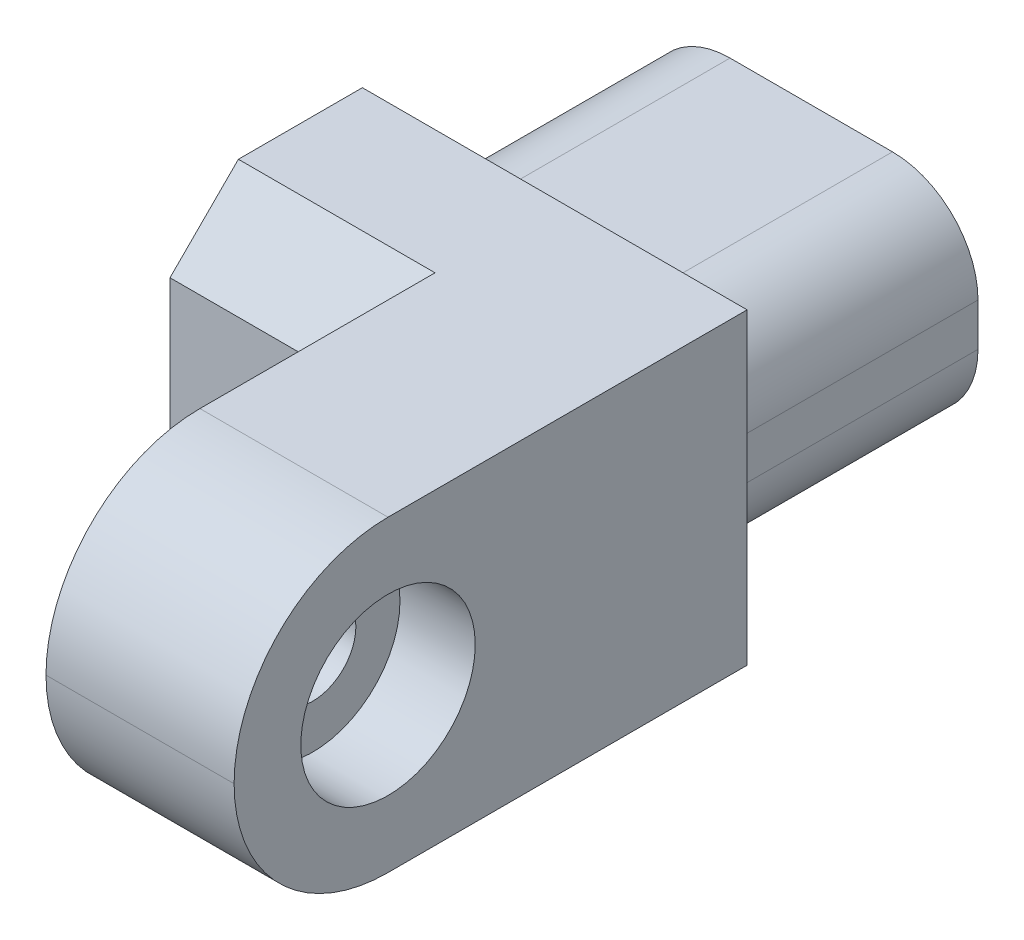
ISO-10303-21;
HEADER;
FILE_DESCRIPTION(('STEP AP214'),'2;1');
FILE_NAME('part.step','',(''),(''),'','','');
FILE_SCHEMA(('AUTOMOTIVE_DESIGN { 1 0 10303 214 1 1 1 1 }'));
ENDSEC;
DATA;
#1=APPLICATION_CONTEXT('core data for automotive mechanical design processes');
#2=APPLICATION_PROTOCOL_DEFINITION('international standard','automotive_design',2000,#1);
#3=PRODUCT_CONTEXT('',#1,'mechanical');
#4=PRODUCT('Part','Part','',(#3));
#5=PRODUCT_RELATED_PRODUCT_CATEGORY('part','',(#4));
#6=PRODUCT_DEFINITION_FORMATION('','',#4);
#7=PRODUCT_DEFINITION_CONTEXT('part definition',#1,'design');
#8=PRODUCT_DEFINITION('design','',#6,#7);
#9=PRODUCT_DEFINITION_SHAPE('','',#8);
#10=(LENGTH_UNIT() NAMED_UNIT(*) SI_UNIT(.MILLI.,.METRE.));
#11=(NAMED_UNIT(*) PLANE_ANGLE_UNIT() SI_UNIT($,.RADIAN.));
#12=(NAMED_UNIT(*) SI_UNIT($,.STERADIAN.) SOLID_ANGLE_UNIT());
#13=UNCERTAINTY_MEASURE_WITH_UNIT(LENGTH_MEASURE(1.E-05),#10,'distance_accuracy_value','');
#14=(GEOMETRIC_REPRESENTATION_CONTEXT(3) GLOBAL_UNCERTAINTY_ASSIGNED_CONTEXT((#13)) GLOBAL_UNIT_ASSIGNED_CONTEXT((#10,
#11,#12)) REPRESENTATION_CONTEXT('',''));
#15=CARTESIAN_POINT('',(0.,0.,0.));
#16=DIRECTION('',(0.,0.,1.));
#17=DIRECTION('',(1.,0.,0.));
#18=AXIS2_PLACEMENT_3D('',#15,#16,#17);
#19=CARTESIAN_POINT('',(14.2875,-11.43,38.1));
#20=DIRECTION('',(-1.,0.,0.));
#21=DIRECTION('',(0.,0.,1.));
#22=AXIS2_PLACEMENT_3D('',#19,#20,#21);
#23=PLANE('',#22);
#24=DIRECTION('',(0.,0.,-1.));
#25=VECTOR('',#24,1.);
#26=CARTESIAN_POINT('',(14.2875,11.43,38.1));
#27=LINE('',#26,#25);
#28=CARTESIAN_POINT('',(14.2875,11.43,26.67));
#29=VERTEX_POINT('',#28);
#30=CARTESIAN_POINT('',(14.2875,11.43,0.));
#31=VERTEX_POINT('',#30);
#32=EDGE_CURVE('E208',#29,#31,#27,.T.);
#33=ORIENTED_EDGE('',*,*,#32,.F.);
#34=CARTESIAN_POINT('',(14.2875,0.,26.67));
#35=DIRECTION('',(-1.,0.,0.));
#36=DIRECTION('',(0.,0.,1.));
#37=AXIS2_PLACEMENT_3D('',#34,#35,#36);
#38=CIRCLE('',#37,11.43);
#39=CARTESIAN_POINT('',(14.2875,0.,38.1));
#40=VERTEX_POINT('',#39);
#41=EDGE_CURVE('E257',#29,#40,#38,.F.);
#42=ORIENTED_EDGE('',*,*,#41,.T.);
#43=CARTESIAN_POINT('',(14.2875,0.,26.67));
#44=DIRECTION('',(-1.,0.,0.));
#45=DIRECTION('',(0.,0.,1.));
#46=AXIS2_PLACEMENT_3D('',#43,#44,#45);
#47=CIRCLE('',#46,11.43);
#48=CARTESIAN_POINT('',(14.2875,-11.43,26.67));
#49=VERTEX_POINT('',#48);
#50=EDGE_CURVE('E254',#40,#49,#47,.F.);
#51=ORIENTED_EDGE('',*,*,#50,.T.);
#52=DIRECTION('',(0.,0.,-1.));
#53=VECTOR('',#52,1.);
#54=CARTESIAN_POINT('',(14.2875,-11.43,38.1));
#55=LINE('',#54,#53);
#56=CARTESIAN_POINT('',(14.2875,-11.43,0.));
#57=VERTEX_POINT('',#56);
#58=EDGE_CURVE('E177',#49,#57,#55,.T.);
#59=ORIENTED_EDGE('',*,*,#58,.T.);
#60=DIRECTION('',(0.,1.,0.));
#61=VECTOR('',#60,1.);
#62=CARTESIAN_POINT('',(14.2875,-11.43,0.));
#63=LINE('',#62,#61);
#64=EDGE_CURVE('E186',#57,#31,#63,.T.);
#65=ORIENTED_EDGE('',*,*,#64,.T.);
#66=EDGE_LOOP('',(#33,#42,#51,#59,#65));
#67=FACE_BOUND('',#66,.T.);
#68=CARTESIAN_POINT('',(14.2875,0.,26.67));
#69=DIRECTION('',(1.,0.,0.));
#70=DIRECTION('',(0.,0.,-1.));
#71=AXIS2_PLACEMENT_3D('',#68,#69,#70);
#72=CIRCLE('',#71,6.477);
#73=CARTESIAN_POINT('',(14.2875,0.,20.193));
#74=VERTEX_POINT('',#73);
#75=EDGE_CURVE('E367',#74,#74,#72,.T.);
#76=ORIENTED_EDGE('',*,*,#75,.F.);
#77=EDGE_LOOP('',(#76));
#78=FACE_BOUND('',#77,.T.);
#79=ADVANCED_FACE('F43',(#67,#78),#23,.F.);
#80=CARTESIAN_POINT('',(-12.3825,-7.9375,-19.05));
#81=DIRECTION('',(-1.,0.,0.));
#82=DIRECTION('',(0.,0.,1.));
#83=AXIS2_PLACEMENT_3D('',#80,#81,#82);
#84=PLANE('',#83);
#85=DIRECTION('',(0.,-1.,0.));
#86=VECTOR('',#85,1.);
#87=CARTESIAN_POINT('',(-12.3825,-7.9375,-19.05));
#88=LINE('',#87,#86);
#89=CARTESIAN_POINT('',(-12.3825,1.5875,-19.05));
#90=VERTEX_POINT('',#89);
#91=CARTESIAN_POINT('',(-12.3825,-1.5875,-19.05));
#92=VERTEX_POINT('',#91);
#93=EDGE_CURVE('E213',#90,#92,#88,.T.);
#94=ORIENTED_EDGE('',*,*,#93,.T.);
#95=DIRECTION('',(0.,0.,1.));
#96=VECTOR('',#95,1.);
#97=CARTESIAN_POINT('',(-12.3825,-1.5875,-19.05));
#98=LINE('',#97,#96);
#99=CARTESIAN_POINT('',(-12.3825,-1.5875,0.));
#100=VERTEX_POINT('',#99);
#101=EDGE_CURVE('E272',#92,#100,#98,.T.);
#102=ORIENTED_EDGE('',*,*,#101,.T.);
#103=DIRECTION('',(0.,-1.,0.));
#104=VECTOR('',#103,1.);
#105=CARTESIAN_POINT('',(-12.3825,-7.9375,0.));
#106=LINE('',#105,#104);
#107=CARTESIAN_POINT('',(-12.3825,1.5875,0.));
#108=VERTEX_POINT('',#107);
#109=EDGE_CURVE('E176',#108,#100,#106,.T.);
#110=ORIENTED_EDGE('',*,*,#109,.F.);
#111=DIRECTION('',(0.,0.,1.));
#112=VECTOR('',#111,1.);
#113=CARTESIAN_POINT('',(-12.3825,1.5875,-19.05));
#114=LINE('',#113,#112);
#115=EDGE_CURVE('E263',#108,#90,#114,.F.);
#116=ORIENTED_EDGE('',*,*,#115,.T.);
#117=EDGE_LOOP('',(#94,#102,#110,#116));
#118=FACE_BOUND('',#117,.T.);
#119=ADVANCED_FACE('F403',(#118),#84,.T.);
#120=CARTESIAN_POINT('',(12.3825,7.9375,-19.05));
#121=DIRECTION('',(0.,1.,0.));
#122=DIRECTION('',(-1.,0.,0.));
#123=AXIS2_PLACEMENT_3D('',#120,#121,#122);
#124=PLANE('',#123);
#125=DIRECTION('',(-1.,0.,0.));
#126=VECTOR('',#125,1.);
#127=CARTESIAN_POINT('',(12.3825,7.9375,-19.05));
#128=LINE('',#127,#126);
#129=CARTESIAN_POINT('',(6.03250000000001,7.9375,-19.05));
#130=VERTEX_POINT('',#129);
#131=CARTESIAN_POINT('',(-6.03249999999999,7.9375,-19.05));
#132=VERTEX_POINT('',#131);
#133=EDGE_CURVE('E226',#130,#132,#128,.T.);
#134=ORIENTED_EDGE('',*,*,#133,.T.);
#135=DIRECTION('',(0.,0.,1.));
#136=VECTOR('',#135,1.);
#137=CARTESIAN_POINT('',(-6.03249999999999,7.9375,-19.05));
#138=LINE('',#137,#136);
#139=CARTESIAN_POINT('',(-6.03249999999999,7.9375,0.));
#140=VERTEX_POINT('',#139);
#141=EDGE_CURVE('E298',#132,#140,#138,.T.);
#142=ORIENTED_EDGE('',*,*,#141,.T.);
#143=DIRECTION('',(-1.,0.,0.));
#144=VECTOR('',#143,1.);
#145=CARTESIAN_POINT('',(12.3825,7.9375,0.));
#146=LINE('',#145,#144);
#147=CARTESIAN_POINT('',(6.03250000000001,7.9375,0.));
#148=VERTEX_POINT('',#147);
#149=EDGE_CURVE('E218',#148,#140,#146,.T.);
#150=ORIENTED_EDGE('',*,*,#149,.F.);
#151=DIRECTION('',(0.,0.,1.));
#152=VECTOR('',#151,1.);
#153=CARTESIAN_POINT('',(6.03250000000001,7.9375,-19.05));
#154=LINE('',#153,#152);
#155=EDGE_CURVE('E295',#148,#130,#154,.F.);
#156=ORIENTED_EDGE('',*,*,#155,.T.);
#157=EDGE_LOOP('',(#134,#142,#150,#156));
#158=FACE_BOUND('',#157,.T.);
#159=ADVANCED_FACE('F409',(#158),#124,.T.);
#160=CARTESIAN_POINT('',(12.3825,-7.9375,-19.05));
#161=DIRECTION('',(1.,0.,0.));
#162=DIRECTION('',(0.,0.,-1.));
#163=AXIS2_PLACEMENT_3D('',#160,#161,#162);
#164=PLANE('',#163);
#165=DIRECTION('',(0.,1.,0.));
#166=VECTOR('',#165,1.);
#167=CARTESIAN_POINT('',(12.3825,-7.9375,0.));
#168=LINE('',#167,#166);
#169=CARTESIAN_POINT('',(12.3825,-1.5875,0.));
#170=VERTEX_POINT('',#169);
#171=CARTESIAN_POINT('',(12.3825,1.5875,0.));
#172=VERTEX_POINT('',#171);
#173=EDGE_CURVE('E238',#170,#172,#168,.T.);
#174=ORIENTED_EDGE('',*,*,#173,.F.);
#175=DIRECTION('',(0.,0.,1.));
#176=VECTOR('',#175,1.);
#177=CARTESIAN_POINT('',(12.3825,-1.5875,-19.05));
#178=LINE('',#177,#176);
#179=CARTESIAN_POINT('',(12.3825,-1.5875,-19.05));
#180=VERTEX_POINT('',#179);
#181=EDGE_CURVE('E306',#170,#180,#178,.F.);
#182=ORIENTED_EDGE('',*,*,#181,.T.);
#183=DIRECTION('',(0.,1.,0.));
#184=VECTOR('',#183,1.);
#185=CARTESIAN_POINT('',(12.3825,-7.9375,-19.05));
#186=LINE('',#185,#184);
#187=CARTESIAN_POINT('',(12.3825,1.5875,-19.05));
#188=VERTEX_POINT('',#187);
#189=EDGE_CURVE('E222',#180,#188,#186,.T.);
#190=ORIENTED_EDGE('',*,*,#189,.T.);
#191=DIRECTION('',(0.,0.,1.));
#192=VECTOR('',#191,1.);
#193=CARTESIAN_POINT('',(12.3825,1.5875,-19.05));
#194=LINE('',#193,#192);
#195=EDGE_CURVE('E302',#188,#172,#194,.T.);
#196=ORIENTED_EDGE('',*,*,#195,.T.);
#197=EDGE_LOOP('',(#174,#182,#190,#196));
#198=FACE_BOUND('',#197,.T.);
#199=ADVANCED_FACE('F427',(#198),#164,.T.);
#200=CARTESIAN_POINT('',(12.3825,-7.9375,-19.05));
#201=DIRECTION('',(0.,-1.,0.));
#202=DIRECTION('',(1.,0.,0.));
#203=AXIS2_PLACEMENT_3D('',#200,#201,#202);
#204=PLANE('',#203);
#205=DIRECTION('',(1.,0.,0.));
#206=VECTOR('',#205,1.);
#207=CARTESIAN_POINT('',(12.3825,-7.9375,0.));
#208=LINE('',#207,#206);
#209=CARTESIAN_POINT('',(-6.0325,-7.9375,0.));
#210=VERTEX_POINT('',#209);
#211=CARTESIAN_POINT('',(6.03250000000001,-7.9375,0.));
#212=VERTEX_POINT('',#211);
#213=EDGE_CURVE('E234',#210,#212,#208,.T.);
#214=ORIENTED_EDGE('',*,*,#213,.F.);
#215=DIRECTION('',(0.,0.,1.));
#216=VECTOR('',#215,1.);
#217=CARTESIAN_POINT('',(-6.0325,-7.9375,-19.05));
#218=LINE('',#217,#216);
#219=CARTESIAN_POINT('',(-6.0325,-7.9375,-19.05));
#220=VERTEX_POINT('',#219);
#221=EDGE_CURVE('E280',#210,#220,#218,.F.);
#222=ORIENTED_EDGE('',*,*,#221,.T.);
#223=DIRECTION('',(1.,0.,0.));
#224=VECTOR('',#223,1.);
#225=CARTESIAN_POINT('',(12.3825,-7.9375,-19.05));
#226=LINE('',#225,#224);
#227=CARTESIAN_POINT('',(6.03250000000001,-7.9375,-19.05));
#228=VERTEX_POINT('',#227);
#229=EDGE_CURVE('E217',#220,#228,#226,.T.);
#230=ORIENTED_EDGE('',*,*,#229,.T.);
#231=DIRECTION('',(0.,0.,1.));
#232=VECTOR('',#231,1.);
#233=CARTESIAN_POINT('',(6.03250000000001,-7.9375,-19.05));
#234=LINE('',#233,#232);
#235=EDGE_CURVE('E276',#228,#212,#234,.T.);
#236=ORIENTED_EDGE('',*,*,#235,.T.);
#237=EDGE_LOOP('',(#214,#222,#230,#236));
#238=FACE_BOUND('',#237,.T.);
#239=ADVANCED_FACE('F423',(#238),#204,.T.);
#240=CARTESIAN_POINT('',(0.,0.,-19.05));
#241=DIRECTION('',(0.,0.,1.));
#242=DIRECTION('',(1.,0.,0.));
#243=AXIS2_PLACEMENT_3D('',#240,#241,#242);
#244=PLANE('',#243);
#245=ORIENTED_EDGE('',*,*,#229,.F.);
#246=CARTESIAN_POINT('',(-6.0325,-1.5875,-19.05));
#247=DIRECTION('',(0.,0.,1.));
#248=DIRECTION('',(1.,0.,0.));
#249=AXIS2_PLACEMENT_3D('',#246,#247,#248);
#250=CIRCLE('',#249,6.35);
#251=EDGE_CURVE('E292',#220,#92,#250,.F.);
#252=ORIENTED_EDGE('',*,*,#251,.T.);
#253=ORIENTED_EDGE('',*,*,#93,.F.);
#254=CARTESIAN_POINT('',(-6.03249999999999,1.5875,-19.05));
#255=DIRECTION('',(0.,0.,1.));
#256=DIRECTION('',(1.,0.,0.));
#257=AXIS2_PLACEMENT_3D('',#254,#255,#256);
#258=CIRCLE('',#257,6.35);
#259=EDGE_CURVE('E289',#90,#132,#258,.F.);
#260=ORIENTED_EDGE('',*,*,#259,.T.);
#261=ORIENTED_EDGE('',*,*,#133,.F.);
#262=CARTESIAN_POINT('',(6.03250000000001,1.5875,-19.05));
#263=DIRECTION('',(0.,0.,1.));
#264=DIRECTION('',(1.,0.,0.));
#265=AXIS2_PLACEMENT_3D('',#262,#263,#264);
#266=CIRCLE('',#265,6.35);
#267=EDGE_CURVE('E283',#130,#188,#266,.F.);
#268=ORIENTED_EDGE('',*,*,#267,.T.);
#269=ORIENTED_EDGE('',*,*,#189,.F.);
#270=CARTESIAN_POINT('',(6.03250000000001,-1.5875,-19.05));
#271=DIRECTION('',(0.,0.,1.));
#272=DIRECTION('',(1.,0.,0.));
#273=AXIS2_PLACEMENT_3D('',#270,#271,#272);
#274=CIRCLE('',#273,6.35);
#275=EDGE_CURVE('E286',#180,#228,#274,.F.);
#276=ORIENTED_EDGE('',*,*,#275,.T.);
#277=EDGE_LOOP('',(#245,#252,#253,#260,#261,#268,#269,#276));
#278=FACE_BOUND('',#277,.T.);
#279=ADVANCED_FACE('F420',(#278),#244,.F.);
#280=CARTESIAN_POINT('',(0.,0.,0.));
#281=DIRECTION('',(0.,0.,1.));
#282=DIRECTION('',(1.,0.,0.));
#283=AXIS2_PLACEMENT_3D('',#280,#281,#282);
#284=PLANE('',#283);
#285=DIRECTION('',(0.,-1.,0.));
#286=VECTOR('',#285,1.);
#287=CARTESIAN_POINT('',(-14.2875,-11.43,0.));
#288=LINE('',#287,#286);
#289=CARTESIAN_POINT('',(-14.2875,11.43,0.));
#290=VERTEX_POINT('',#289);
#291=CARTESIAN_POINT('',(-14.2875,-11.43,0.));
#292=VERTEX_POINT('',#291);
#293=EDGE_CURVE('E184',#290,#292,#288,.T.);
#294=ORIENTED_EDGE('',*,*,#293,.F.);
#295=DIRECTION('',(-1.,0.,0.));
#296=VECTOR('',#295,1.);
#297=CARTESIAN_POINT('',(14.2875,11.43,0.));
#298=LINE('',#297,#296);
#299=EDGE_CURVE('E203',#31,#290,#298,.T.);
#300=ORIENTED_EDGE('',*,*,#299,.F.);
#301=ORIENTED_EDGE('',*,*,#64,.F.);
#302=DIRECTION('',(1.,0.,0.));
#303=VECTOR('',#302,1.);
#304=CARTESIAN_POINT('',(14.2875,-11.43,0.));
#305=LINE('',#304,#303);
#306=EDGE_CURVE('E169',#292,#57,#305,.T.);
#307=ORIENTED_EDGE('',*,*,#306,.F.);
#308=EDGE_LOOP('',(#294,#300,#301,#307));
#309=FACE_BOUND('',#308,.T.);
#310=ORIENTED_EDGE('',*,*,#173,.T.);
#311=CARTESIAN_POINT('',(6.03250000000001,1.5875,0.));
#312=DIRECTION('',(0.,0.,1.));
#313=DIRECTION('',(1.,0.,0.));
#314=AXIS2_PLACEMENT_3D('',#311,#312,#313);
#315=CIRCLE('',#314,6.35);
#316=EDGE_CURVE('E318',#172,#148,#315,.T.);
#317=ORIENTED_EDGE('',*,*,#316,.T.);
#318=ORIENTED_EDGE('',*,*,#149,.T.);
#319=CARTESIAN_POINT('',(-6.03249999999999,1.5875,0.));
#320=DIRECTION('',(0.,0.,1.));
#321=DIRECTION('',(1.,0.,0.));
#322=AXIS2_PLACEMENT_3D('',#319,#320,#321);
#323=CIRCLE('',#322,6.35);
#324=EDGE_CURVE('E312',#140,#108,#323,.T.);
#325=ORIENTED_EDGE('',*,*,#324,.T.);
#326=ORIENTED_EDGE('',*,*,#109,.T.);
#327=CARTESIAN_POINT('',(-6.0325,-1.5875,0.));
#328=DIRECTION('',(0.,0.,1.));
#329=DIRECTION('',(1.,0.,0.));
#330=AXIS2_PLACEMENT_3D('',#327,#328,#329);
#331=CIRCLE('',#330,6.35);
#332=EDGE_CURVE('E309',#100,#210,#331,.T.);
#333=ORIENTED_EDGE('',*,*,#332,.T.);
#334=ORIENTED_EDGE('',*,*,#213,.T.);
#335=CARTESIAN_POINT('',(6.03250000000001,-1.5875,0.));
#336=DIRECTION('',(0.,0.,1.));
#337=DIRECTION('',(1.,0.,0.));
#338=AXIS2_PLACEMENT_3D('',#335,#336,#337);
#339=CIRCLE('',#338,6.35);
#340=EDGE_CURVE('E315',#212,#170,#339,.T.);
#341=ORIENTED_EDGE('',*,*,#340,.T.);
#342=EDGE_LOOP('',(#310,#317,#318,#325,#326,#333,#334,#341));
#343=FACE_BOUND('',#342,.T.);
#344=ADVANCED_FACE('F181',(#309,#343),#284,.F.);
#345=CARTESIAN_POINT('',(-14.2875,-11.43,38.1));
#346=DIRECTION('',(1.,0.,0.));
#347=DIRECTION('',(0.,0.,-1.));
#348=AXIS2_PLACEMENT_3D('',#345,#346,#347);
#349=PLANE('',#348);
#350=DIRECTION('',(0.,0.,-1.));
#351=VECTOR('',#350,1.);
#352=CARTESIAN_POINT('',(-14.2875,-11.43,38.1));
#353=LINE('',#352,#351);
#354=CARTESIAN_POINT('',(-14.2875,-11.43,9.20749999999999));
#355=VERTEX_POINT('',#354);
#356=EDGE_CURVE('E165',#355,#292,#353,.T.);
#357=ORIENTED_EDGE('',*,*,#356,.F.);
#358=DIRECTION('',(0.,-0.707106781186546,-0.707106781186549));
#359=VECTOR('',#358,1.);
#360=CARTESIAN_POINT('',(-14.2875,-6.34999999999999,14.2875));
#361=LINE('',#360,#359);
#362=CARTESIAN_POINT('',(-14.2875,-6.34999999999999,14.2875));
#363=VERTEX_POINT('',#362);
#364=EDGE_CURVE('E332',#355,#363,#361,.F.);
#365=ORIENTED_EDGE('',*,*,#364,.T.);
#366=DIRECTION('',(0.,-1.,0.));
#367=VECTOR('',#366,1.);
#368=CARTESIAN_POINT('',(-14.2875,11.43,14.2875));
#369=LINE('',#368,#367);
#370=CARTESIAN_POINT('',(-14.2875,6.34999999999998,14.2875));
#371=VERTEX_POINT('',#370);
#372=EDGE_CURVE('E197',#371,#363,#369,.T.);
#373=ORIENTED_EDGE('',*,*,#372,.F.);
#374=DIRECTION('',(0.,-0.707106781186549,0.707106781186546));
#375=VECTOR('',#374,1.);
#376=CARTESIAN_POINT('',(-14.2875,11.43,9.20750000000001));
#377=LINE('',#376,#375);
#378=CARTESIAN_POINT('',(-14.2875,11.43,9.20750000000001));
#379=VERTEX_POINT('',#378);
#380=EDGE_CURVE('E68',#371,#379,#377,.F.);
#381=ORIENTED_EDGE('',*,*,#380,.T.);
#382=DIRECTION('',(0.,0.,-1.));
#383=VECTOR('',#382,1.);
#384=CARTESIAN_POINT('',(-14.2875,11.43,38.1));
#385=LINE('',#384,#383);
#386=EDGE_CURVE('E190',#379,#290,#385,.T.);
#387=ORIENTED_EDGE('',*,*,#386,.T.);
#388=ORIENTED_EDGE('',*,*,#293,.T.);
#389=EDGE_LOOP('',(#357,#365,#373,#381,#387,#388));
#390=FACE_BOUND('',#389,.T.);
#391=ADVANCED_FACE('F189',(#390),#349,.F.);
#392=CARTESIAN_POINT('',(14.2875,-11.43,38.1));
#393=DIRECTION('',(0.,1.,0.));
#394=DIRECTION('',(-1.,0.,0.));
#395=AXIS2_PLACEMENT_3D('',#392,#393,#394);
#396=PLANE('',#395);
#397=DIRECTION('',(0.,0.,1.));
#398=VECTOR('',#397,1.);
#399=CARTESIAN_POINT('',(0.317499999999998,-11.43,38.1));
#400=LINE('',#399,#398);
#401=CARTESIAN_POINT('',(0.317499999999998,-11.43,9.20749999999998));
#402=VERTEX_POINT('',#401);
#403=CARTESIAN_POINT('',(0.317499999999998,-11.43,26.67));
#404=VERTEX_POINT('',#403);
#405=EDGE_CURVE('E268',#402,#404,#400,.T.);
#406=ORIENTED_EDGE('',*,*,#405,.F.);
#407=DIRECTION('',(-1.,0.,0.));
#408=VECTOR('',#407,1.);
#409=CARTESIAN_POINT('',(14.2875,-11.43,9.20749999999998));
#410=LINE('',#409,#408);
#411=EDGE_CURVE('E172',#402,#355,#410,.T.);
#412=ORIENTED_EDGE('',*,*,#411,.T.);
#413=ORIENTED_EDGE('',*,*,#356,.T.);
#414=ORIENTED_EDGE('',*,*,#306,.T.);
#415=ORIENTED_EDGE('',*,*,#58,.F.);
#416=DIRECTION('',(1.,0.,0.));
#417=VECTOR('',#416,1.);
#418=CARTESIAN_POINT('',(0.317499999999998,-11.43,26.67));
#419=LINE('',#418,#417);
#420=EDGE_CURVE('E260',#49,#404,#419,.F.);
#421=ORIENTED_EDGE('',*,*,#420,.T.);
#422=EDGE_LOOP('',(#406,#412,#413,#414,#415,#421));
#423=FACE_BOUND('',#422,.T.);
#424=ADVANCED_FACE('F167',(#423),#396,.F.);
#425=CARTESIAN_POINT('',(14.2875,11.43,38.1));
#426=DIRECTION('',(0.,-1.,0.));
#427=DIRECTION('',(1.,0.,0.));
#428=AXIS2_PLACEMENT_3D('',#425,#426,#427);
#429=PLANE('',#428);
#430=ORIENTED_EDGE('',*,*,#386,.F.);
#431=DIRECTION('',(1.,0.,0.));
#432=VECTOR('',#431,1.);
#433=CARTESIAN_POINT('',(14.2875,11.43,9.20750000000001));
#434=LINE('',#433,#432);
#435=CARTESIAN_POINT('',(0.317499999999994,11.43,9.20750000000001));
#436=VERTEX_POINT('',#435);
#437=EDGE_CURVE('E335',#379,#436,#434,.T.);
#438=ORIENTED_EDGE('',*,*,#437,.T.);
#439=DIRECTION('',(0.,0.,1.));
#440=VECTOR('',#439,1.);
#441=CARTESIAN_POINT('',(0.317499999999994,11.43,38.1));
#442=LINE('',#441,#440);
#443=CARTESIAN_POINT('',(0.317499999999994,11.43,26.67));
#444=VERTEX_POINT('',#443);
#445=EDGE_CURVE('E60',#436,#444,#442,.T.);
#446=ORIENTED_EDGE('',*,*,#445,.T.);
#447=DIRECTION('',(-1.,0.,0.));
#448=VECTOR('',#447,1.);
#449=CARTESIAN_POINT('',(14.2875,11.43,26.67));
#450=LINE('',#449,#448);
#451=EDGE_CURVE('E250',#444,#29,#450,.F.);
#452=ORIENTED_EDGE('',*,*,#451,.T.);
#453=ORIENTED_EDGE('',*,*,#32,.T.);
#454=ORIENTED_EDGE('',*,*,#299,.T.);
#455=EDGE_LOOP('',(#430,#438,#446,#452,#453,#454));
#456=FACE_BOUND('',#455,.T.);
#457=ADVANCED_FACE('F392',(#456),#429,.F.);
#458=CARTESIAN_POINT('',(0.317499999999994,11.43,38.1));
#459=DIRECTION('',(1.,0.,0.));
#460=DIRECTION('',(0.,1.,0.));
#461=AXIS2_PLACEMENT_3D('',#458,#459,#460);
#462=PLANE('',#461);
#463=CARTESIAN_POINT('',(0.317499999999996,0.,26.67));
#464=DIRECTION('',(1.,0.,0.));
#465=DIRECTION('',(0.,1.,0.));
#466=AXIS2_PLACEMENT_3D('',#463,#464,#465);
#467=CIRCLE('',#466,6.477);
#468=CARTESIAN_POINT('',(0.317499999999995,6.477,26.67));
#469=VERTEX_POINT('',#468);
#470=EDGE_CURVE('E48',#469,#469,#467,.T.);
#471=ORIENTED_EDGE('',*,*,#470,.T.);
#472=EDGE_LOOP('',(#471));
#473=FACE_BOUND('',#472,.T.);
#474=CARTESIAN_POINT('',(0.317499999999996,0.,26.67));
#475=DIRECTION('',(1.,0.,0.));
#476=DIRECTION('',(0.,1.,0.));
#477=AXIS2_PLACEMENT_3D('',#474,#475,#476);
#478=CIRCLE('',#477,11.43);
#479=CARTESIAN_POINT('',(0.317499999999996,0.,38.1));
#480=VERTEX_POINT('',#479);
#481=EDGE_CURVE('E230',#404,#480,#478,.F.);
#482=ORIENTED_EDGE('',*,*,#481,.T.);
#483=CARTESIAN_POINT('',(0.317499999999996,0.,26.67));
#484=DIRECTION('',(1.,0.,0.));
#485=DIRECTION('',(0.,1.,0.));
#486=AXIS2_PLACEMENT_3D('',#483,#484,#485);
#487=CIRCLE('',#486,11.43);
#488=EDGE_CURVE('E247',#480,#444,#487,.F.);
#489=ORIENTED_EDGE('',*,*,#488,.T.);
#490=ORIENTED_EDGE('',*,*,#445,.F.);
#491=DIRECTION('',(0.,0.707106781186549,-0.707106781186546));
#492=VECTOR('',#491,1.);
#493=CARTESIAN_POINT('',(0.317499999999996,-3.01624999999999,23.65375));
#494=LINE('',#493,#492);
#495=CARTESIAN_POINT('',(0.317499999999995,6.34999999999999,14.2875));
#496=VERTEX_POINT('',#495);
#497=EDGE_CURVE('E11',#436,#496,#494,.F.);
#498=ORIENTED_EDGE('',*,*,#497,.T.);
#499=DIRECTION('',(0.,-1.,0.));
#500=VECTOR('',#499,1.);
#501=CARTESIAN_POINT('',(0.317499999999994,11.43,14.2875));
#502=LINE('',#501,#500);
#503=CARTESIAN_POINT('',(0.317499999999997,-6.34999999999999,14.2875));
#504=VERTEX_POINT('',#503);
#505=EDGE_CURVE('E193',#496,#504,#502,.T.);
#506=ORIENTED_EDGE('',*,*,#505,.T.);
#507=DIRECTION('',(0.,0.707106781186546,0.707106781186549));
#508=VECTOR('',#507,1.);
#509=CARTESIAN_POINT('',(0.317499999999993,14.44625,35.08375));
#510=LINE('',#509,#508);
#511=EDGE_CURVE('E54',#504,#402,#510,.F.);
#512=ORIENTED_EDGE('',*,*,#511,.T.);
#513=ORIENTED_EDGE('',*,*,#405,.T.);
#514=EDGE_LOOP('',(#482,#489,#490,#498,#506,#512,#513));
#515=FACE_BOUND('',#514,.T.);
#516=ADVANCED_FACE('F342',(#473,#515),#462,.F.);
#517=CARTESIAN_POINT('',(-14.2875,11.43,14.2875));
#518=DIRECTION('',(0.,0.,-1.));
#519=DIRECTION('',(-1.,0.,0.));
#520=AXIS2_PLACEMENT_3D('',#517,#518,#519);
#521=PLANE('',#520);
#522=ORIENTED_EDGE('',*,*,#372,.T.);
#523=DIRECTION('',(1.,0.,0.));
#524=VECTOR('',#523,1.);
#525=CARTESIAN_POINT('',(-14.2875,-6.34999999999999,14.2875));
#526=LINE('',#525,#524);
#527=EDGE_CURVE('E324',#363,#504,#526,.T.);
#528=ORIENTED_EDGE('',*,*,#527,.T.);
#529=ORIENTED_EDGE('',*,*,#505,.F.);
#530=DIRECTION('',(-1.,0.,0.));
#531=VECTOR('',#530,1.);
#532=CARTESIAN_POINT('',(-14.2875,6.34999999999998,14.2875));
#533=LINE('',#532,#531);
#534=EDGE_CURVE('E321',#496,#371,#533,.T.);
#535=ORIENTED_EDGE('',*,*,#534,.T.);
#536=EDGE_LOOP('',(#522,#528,#529,#535));
#537=FACE_BOUND('',#536,.T.);
#538=ADVANCED_FACE('F350',(#537),#521,.F.);
#539=CARTESIAN_POINT('',(0.,0.,26.67));
#540=DIRECTION('',(-1.,0.,0.));
#541=DIRECTION('',(0.,-1.,0.));
#542=AXIS2_PLACEMENT_3D('',#539,#540,#541);
#543=CYLINDRICAL_SURFACE('',#542,11.43);
#544=ORIENTED_EDGE('',*,*,#420,.F.);
#545=ORIENTED_EDGE('',*,*,#50,.F.);
#546=DIRECTION('',(1.,0.,0.));
#547=VECTOR('',#546,1.);
#548=CARTESIAN_POINT('',(14.2875,0.,38.1));
#549=LINE('',#548,#547);
#550=EDGE_CURVE('E264',#480,#40,#549,.T.);
#551=ORIENTED_EDGE('',*,*,#550,.F.);
#552=ORIENTED_EDGE('',*,*,#481,.F.);
#553=EDGE_LOOP('',(#544,#545,#551,#552));
#554=FACE_BOUND('',#553,.T.);
#555=ADVANCED_FACE('F398',(#554),#543,.T.);
#556=CARTESIAN_POINT('',(0.,0.,26.67));
#557=DIRECTION('',(1.,0.,0.));
#558=DIRECTION('',(0.,1.,0.));
#559=AXIS2_PLACEMENT_3D('',#556,#557,#558);
#560=CYLINDRICAL_SURFACE('',#559,11.43);
#561=ORIENTED_EDGE('',*,*,#41,.F.);
#562=ORIENTED_EDGE('',*,*,#451,.F.);
#563=ORIENTED_EDGE('',*,*,#488,.F.);
#564=ORIENTED_EDGE('',*,*,#550,.T.);
#565=EDGE_LOOP('',(#561,#562,#563,#564));
#566=FACE_BOUND('',#565,.T.);
#567=ADVANCED_FACE('F435',(#566),#560,.T.);
#568=CARTESIAN_POINT('',(-6.0325,-1.5875,-19.05));
#569=DIRECTION('',(0.,0.,1.));
#570=DIRECTION('',(1.,0.,0.));
#571=AXIS2_PLACEMENT_3D('',#568,#569,#570);
#572=CYLINDRICAL_SURFACE('',#571,6.35);
#573=ORIENTED_EDGE('',*,*,#251,.F.);
#574=ORIENTED_EDGE('',*,*,#221,.F.);
#575=ORIENTED_EDGE('',*,*,#332,.F.);
#576=ORIENTED_EDGE('',*,*,#101,.F.);
#577=EDGE_LOOP('',(#573,#574,#575,#576));
#578=FACE_BOUND('',#577,.T.);
#579=ADVANCED_FACE('F438',(#578),#572,.T.);
#580=CARTESIAN_POINT('',(-6.03249999999999,1.5875,-19.05));
#581=DIRECTION('',(0.,0.,1.));
#582=DIRECTION('',(1.,0.,0.));
#583=AXIS2_PLACEMENT_3D('',#580,#581,#582);
#584=CYLINDRICAL_SURFACE('',#583,6.35);
#585=ORIENTED_EDGE('',*,*,#259,.F.);
#586=ORIENTED_EDGE('',*,*,#115,.F.);
#587=ORIENTED_EDGE('',*,*,#324,.F.);
#588=ORIENTED_EDGE('',*,*,#141,.F.);
#589=EDGE_LOOP('',(#585,#586,#587,#588));
#590=FACE_BOUND('',#589,.T.);
#591=ADVANCED_FACE('F445',(#590),#584,.T.);
#592=CARTESIAN_POINT('',(6.03250000000001,-1.5875,-19.05));
#593=DIRECTION('',(0.,0.,1.));
#594=DIRECTION('',(1.,0.,0.));
#595=AXIS2_PLACEMENT_3D('',#592,#593,#594);
#596=CYLINDRICAL_SURFACE('',#595,6.35);
#597=ORIENTED_EDGE('',*,*,#275,.F.);
#598=ORIENTED_EDGE('',*,*,#181,.F.);
#599=ORIENTED_EDGE('',*,*,#340,.F.);
#600=ORIENTED_EDGE('',*,*,#235,.F.);
#601=EDGE_LOOP('',(#597,#598,#599,#600));
#602=FACE_BOUND('',#601,.T.);
#603=ADVANCED_FACE('F449',(#602),#596,.T.);
#604=CARTESIAN_POINT('',(6.03250000000001,1.5875,-19.05));
#605=DIRECTION('',(0.,0.,1.));
#606=DIRECTION('',(1.,0.,0.));
#607=AXIS2_PLACEMENT_3D('',#604,#605,#606);
#608=CYLINDRICAL_SURFACE('',#607,6.35);
#609=ORIENTED_EDGE('',*,*,#267,.F.);
#610=ORIENTED_EDGE('',*,*,#155,.F.);
#611=ORIENTED_EDGE('',*,*,#316,.F.);
#612=ORIENTED_EDGE('',*,*,#195,.F.);
#613=EDGE_LOOP('',(#609,#610,#611,#612));
#614=FACE_BOUND('',#613,.T.);
#615=ADVANCED_FACE('F453',(#614),#608,.T.);
#616=CARTESIAN_POINT('',(-14.2875,-6.34999999999999,14.2875));
#617=DIRECTION('',(0.,0.707106781186549,-0.707106781186546));
#618=DIRECTION('',(1.,0.,0.));
#619=AXIS2_PLACEMENT_3D('',#616,#617,#618);
#620=PLANE('',#619);
#621=ORIENTED_EDGE('',*,*,#364,.F.);
#622=ORIENTED_EDGE('',*,*,#411,.F.);
#623=ORIENTED_EDGE('',*,*,#511,.F.);
#624=ORIENTED_EDGE('',*,*,#527,.F.);
#625=EDGE_LOOP('',(#621,#622,#623,#624));
#626=FACE_BOUND('',#625,.T.);
#627=ADVANCED_FACE('F347',(#626),#620,.F.);
#628=CARTESIAN_POINT('',(14.2875,11.43,9.20750000000001));
#629=DIRECTION('',(0.,-0.707106781186546,-0.707106781186549));
#630=DIRECTION('',(1.,0.,0.));
#631=AXIS2_PLACEMENT_3D('',#628,#629,#630);
#632=PLANE('',#631);
#633=ORIENTED_EDGE('',*,*,#380,.F.);
#634=ORIENTED_EDGE('',*,*,#534,.F.);
#635=ORIENTED_EDGE('',*,*,#497,.F.);
#636=ORIENTED_EDGE('',*,*,#437,.F.);
#637=EDGE_LOOP('',(#633,#634,#635,#636));
#638=FACE_BOUND('',#637,.T.);
#639=ADVANCED_FACE('F46',(#638),#632,.F.);
#640=CARTESIAN_POINT('',(14.2875,0.,26.67));
#641=DIRECTION('',(1.,0.,0.));
#642=DIRECTION('',(0.,0.,-1.));
#643=AXIS2_PLACEMENT_3D('',#640,#641,#642);
#644=CYLINDRICAL_SURFACE('',#643,3.2004);
#645=CARTESIAN_POINT('',(5.2705,0.,26.67));
#646=DIRECTION('',(-1.,0.,0.));
#647=DIRECTION('',(0.,0.,1.));
#648=AXIS2_PLACEMENT_3D('',#645,#646,#647);
#649=CIRCLE('',#648,3.2004);
#650=CARTESIAN_POINT('',(5.2705,0.,29.8704));
#651=VERTEX_POINT('',#650);
#652=EDGE_CURVE('E371',#651,#651,#649,.T.);
#653=ORIENTED_EDGE('',*,*,#652,.T.);
#654=EDGE_LOOP('',(#653));
#655=FACE_BOUND('',#654,.T.);
#656=CARTESIAN_POINT('',(8.6995,0.,26.67));
#657=DIRECTION('',(1.,0.,0.));
#658=DIRECTION('',(0.,0.,-1.));
#659=AXIS2_PLACEMENT_3D('',#656,#657,#658);
#660=CIRCLE('',#659,3.2004);
#661=CARTESIAN_POINT('',(8.6995,0.,23.4696));
#662=VERTEX_POINT('',#661);
#663=EDGE_CURVE('E269',#662,#662,#660,.T.);
#664=ORIENTED_EDGE('',*,*,#663,.T.);
#665=EDGE_LOOP('',(#664));
#666=FACE_BOUND('',#665,.T.);
#667=ADVANCED_FACE('F464',(#655,#666),#644,.F.);
#668=CARTESIAN_POINT('',(8.6995,3.2004,26.67));
#669=DIRECTION('',(-1.,0.,0.));
#670=DIRECTION('',(0.,0.,1.));
#671=AXIS2_PLACEMENT_3D('',#668,#669,#670);
#672=PLANE('',#671);
#673=ORIENTED_EDGE('',*,*,#663,.F.);
#674=EDGE_LOOP('',(#673));
#675=FACE_BOUND('',#674,.T.);
#676=CARTESIAN_POINT('',(8.6995,0.,26.67));
#677=DIRECTION('',(1.,0.,0.));
#678=DIRECTION('',(0.,0.,-1.));
#679=AXIS2_PLACEMENT_3D('',#676,#677,#678);
#680=CIRCLE('',#679,6.477);
#681=CARTESIAN_POINT('',(8.6995,0.,20.193));
#682=VERTEX_POINT('',#681);
#683=EDGE_CURVE('E363',#682,#682,#680,.T.);
#684=ORIENTED_EDGE('',*,*,#683,.T.);
#685=EDGE_LOOP('',(#684));
#686=FACE_BOUND('',#685,.T.);
#687=ADVANCED_FACE('F469',(#675,#686),#672,.F.);
#688=CARTESIAN_POINT('',(14.2875,0.,26.67));
#689=DIRECTION('',(1.,0.,0.));
#690=DIRECTION('',(0.,0.,-1.));
#691=AXIS2_PLACEMENT_3D('',#688,#689,#690);
#692=CYLINDRICAL_SURFACE('',#691,6.477);
#693=ORIENTED_EDGE('',*,*,#683,.F.);
#694=EDGE_LOOP('',(#693));
#695=FACE_BOUND('',#694,.T.);
#696=ORIENTED_EDGE('',*,*,#75,.T.);
#697=EDGE_LOOP('',(#696));
#698=FACE_BOUND('',#697,.T.);
#699=ADVANCED_FACE('F385',(#695,#698),#692,.F.);
#700=CARTESIAN_POINT('',(-0.317499999999998,0.,26.67));
#701=DIRECTION('',(-1.,0.,0.));
#702=DIRECTION('',(0.,0.,1.));
#703=AXIS2_PLACEMENT_3D('',#700,#701,#702);
#704=CYLINDRICAL_SURFACE('',#703,6.477);
#705=CARTESIAN_POINT('',(5.2705,0.,26.67));
#706=DIRECTION('',(-1.,0.,0.));
#707=DIRECTION('',(0.,0.,1.));
#708=AXIS2_PLACEMENT_3D('',#705,#706,#707);
#709=CIRCLE('',#708,6.477);
#710=CARTESIAN_POINT('',(5.2705,0.,33.147));
#711=VERTEX_POINT('',#710);
#712=EDGE_CURVE('E375',#711,#711,#709,.T.);
#713=ORIENTED_EDGE('',*,*,#712,.F.);
#714=EDGE_LOOP('',(#713));
#715=FACE_BOUND('',#714,.T.);
#716=ORIENTED_EDGE('',*,*,#470,.F.);
#717=EDGE_LOOP('',(#716));
#718=FACE_BOUND('',#717,.T.);
#719=ADVANCED_FACE('F382',(#715,#718),#704,.F.);
#720=CARTESIAN_POINT('',(5.2705,3.2004,26.67));
#721=DIRECTION('',(1.,0.,0.));
#722=DIRECTION('',(0.,0.,-1.));
#723=AXIS2_PLACEMENT_3D('',#720,#721,#722);
#724=PLANE('',#723);
#725=ORIENTED_EDGE('',*,*,#652,.F.);
#726=EDGE_LOOP('',(#725));
#727=FACE_BOUND('',#726,.T.);
#728=ORIENTED_EDGE('',*,*,#712,.T.);
#729=EDGE_LOOP('',(#728));
#730=FACE_BOUND('',#729,.T.);
#731=ADVANCED_FACE('F380',(#727,#730),#724,.F.);
#732=CLOSED_SHELL('',(#79,#119,#159,#199,#239,#279,#344,#391,#424,#457,#516,#538,#555,#567,#579,
#591,#603,#615,#627,#639,#667,#687,#699,#719,#731));
#733=MANIFOLD_SOLID_BREP('B2',#732);
#734=ADVANCED_BREP_SHAPE_REPRESENTATION('',(#18,#733),#14);
#735=SHAPE_DEFINITION_REPRESENTATION(#9,#734);
ENDSEC;
END-ISO-10303-21;
